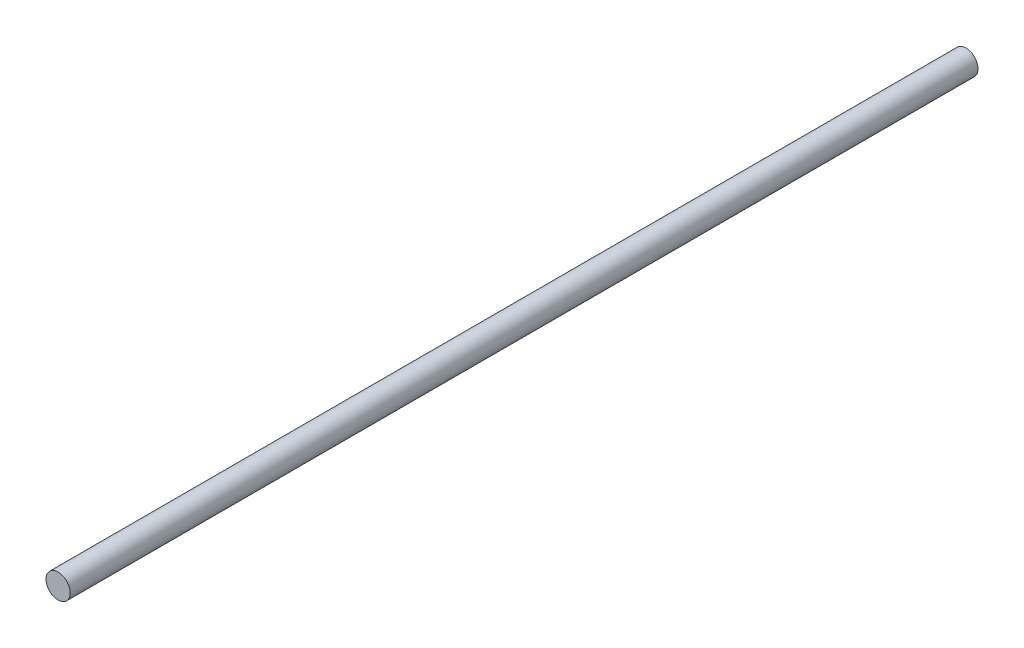
ISO-10303-21;
HEADER;
FILE_DESCRIPTION(('STEP AP214'),'2;1');
FILE_NAME('part.step','',(''),(''),'','','');
FILE_SCHEMA(('AUTOMOTIVE_DESIGN { 1 0 10303 214 1 1 1 1 }'));
ENDSEC;
DATA;
#1=APPLICATION_CONTEXT('core data for automotive mechanical design processes');
#2=APPLICATION_PROTOCOL_DEFINITION('international standard','automotive_design',2000,#1);
#3=PRODUCT_CONTEXT('',#1,'mechanical');
#4=PRODUCT('Part','Part','',(#3));
#5=PRODUCT_RELATED_PRODUCT_CATEGORY('part','',(#4));
#6=PRODUCT_DEFINITION_FORMATION('','',#4);
#7=PRODUCT_DEFINITION_CONTEXT('part definition',#1,'design');
#8=PRODUCT_DEFINITION('design','',#6,#7);
#9=PRODUCT_DEFINITION_SHAPE('','',#8);
#10=(LENGTH_UNIT() NAMED_UNIT(*) SI_UNIT(.MILLI.,.METRE.));
#11=(NAMED_UNIT(*) PLANE_ANGLE_UNIT() SI_UNIT($,.RADIAN.));
#12=(NAMED_UNIT(*) SI_UNIT($,.STERADIAN.) SOLID_ANGLE_UNIT());
#13=UNCERTAINTY_MEASURE_WITH_UNIT(LENGTH_MEASURE(1.E-05),#10,'distance_accuracy_value','');
#14=(GEOMETRIC_REPRESENTATION_CONTEXT(3) GLOBAL_UNCERTAINTY_ASSIGNED_CONTEXT((#13)) GLOBAL_UNIT_ASSIGNED_CONTEXT((#10,
#11,#12)) REPRESENTATION_CONTEXT('',''));
#15=CARTESIAN_POINT('',(0.,0.,0.));
#16=DIRECTION('',(0.,0.,1.));
#17=DIRECTION('',(1.,0.,0.));
#18=AXIS2_PLACEMENT_3D('',#15,#16,#17);
#19=CARTESIAN_POINT('',(0.,0.,37.5));
#20=DIRECTION('',(0.,0.,-1.));
#21=DIRECTION('',(-1.,0.,0.));
#22=AXIS2_PLACEMENT_3D('',#19,#20,#21);
#23=CYLINDRICAL_SURFACE('',#22,1.);
#24=CARTESIAN_POINT('',(0.,0.,37.5));
#25=DIRECTION('',(0.,0.,1.));
#26=DIRECTION('',(1.,0.,0.));
#27=AXIS2_PLACEMENT_3D('',#24,#25,#26);
#28=CIRCLE('',#27,1.);
#29=CARTESIAN_POINT('',(1.,0.,37.5));
#30=VERTEX_POINT('',#29);
#31=EDGE_CURVE('E10',#30,#30,#28,.T.);
#32=ORIENTED_EDGE('',*,*,#31,.F.);
#33=EDGE_LOOP('',(#32));
#34=FACE_BOUND('',#33,.T.);
#35=CARTESIAN_POINT('',(0.,0.,-37.5));
#36=DIRECTION('',(0.,0.,1.));
#37=DIRECTION('',(1.,0.,0.));
#38=AXIS2_PLACEMENT_3D('',#35,#36,#37);
#39=CIRCLE('',#38,1.);
#40=CARTESIAN_POINT('',(1.,0.,-37.5));
#41=VERTEX_POINT('',#40);
#42=EDGE_CURVE('E35',#41,#41,#39,.T.);
#43=ORIENTED_EDGE('',*,*,#42,.T.);
#44=EDGE_LOOP('',(#43));
#45=FACE_BOUND('',#44,.T.);
#46=ADVANCED_FACE('F32',(#34,#45),#23,.T.);
#47=CARTESIAN_POINT('',(0.,0.,37.5));
#48=DIRECTION('',(0.,0.,1.));
#49=DIRECTION('',(1.,0.,0.));
#50=AXIS2_PLACEMENT_3D('',#47,#48,#49);
#51=PLANE('',#50);
#52=ORIENTED_EDGE('',*,*,#31,.T.);
#53=EDGE_LOOP('',(#52));
#54=FACE_BOUND('',#53,.T.);
#55=ADVANCED_FACE('F47',(#54),#51,.T.);
#56=CARTESIAN_POINT('',(0.,0.,-37.5));
#57=DIRECTION('',(0.,0.,1.));
#58=DIRECTION('',(1.,0.,0.));
#59=AXIS2_PLACEMENT_3D('',#56,#57,#58);
#60=PLANE('',#59);
#61=ORIENTED_EDGE('',*,*,#42,.F.);
#62=EDGE_LOOP('',(#61));
#63=FACE_BOUND('',#62,.T.);
#64=ADVANCED_FACE('F45',(#63),#60,.F.);
#65=CLOSED_SHELL('',(#46,#55,#64));
#66=MANIFOLD_SOLID_BREP('B2',#65);
#67=ADVANCED_BREP_SHAPE_REPRESENTATION('',(#18,#66),#14);
#68=SHAPE_DEFINITION_REPRESENTATION(#9,#67);
ENDSEC;
END-ISO-10303-21;
